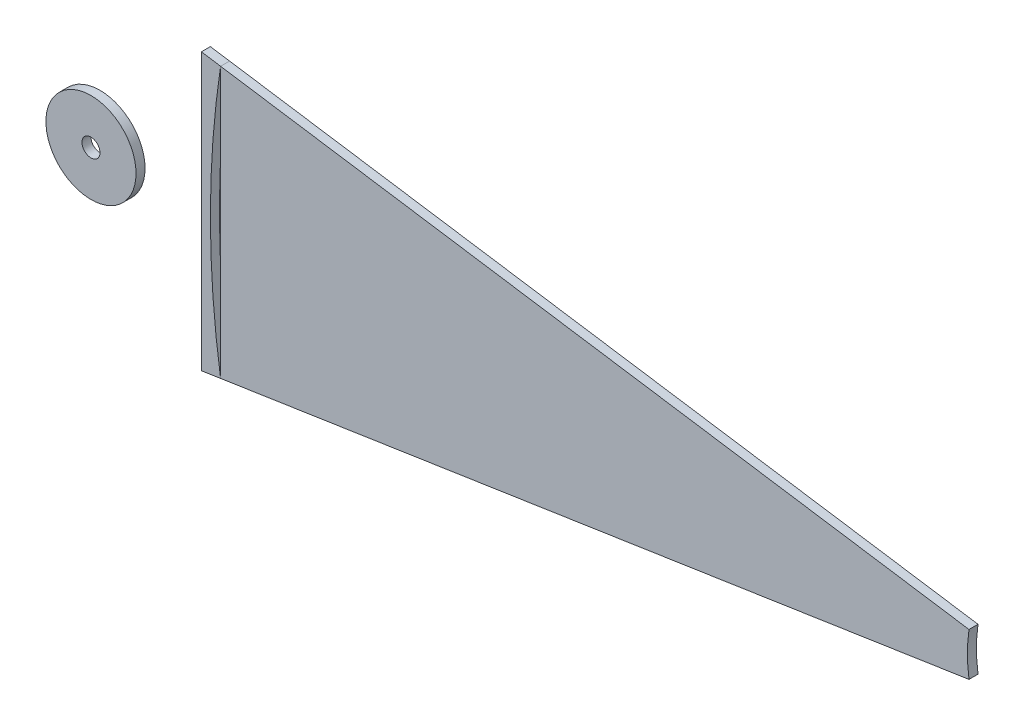
ISO-10303-21;
HEADER;
FILE_DESCRIPTION(('STEP AP214'),'2;1');
FILE_NAME('part.step','',(''),(''),'','','');
FILE_SCHEMA(('AUTOMOTIVE_DESIGN { 1 0 10303 214 1 1 1 1 }'));
ENDSEC;
DATA;
#1=APPLICATION_CONTEXT('core data for automotive mechanical design processes');
#2=APPLICATION_PROTOCOL_DEFINITION('international standard','automotive_design',2000,#1);
#3=PRODUCT_CONTEXT('',#1,'mechanical');
#4=PRODUCT('Part','Part','',(#3));
#5=PRODUCT_RELATED_PRODUCT_CATEGORY('part','',(#4));
#6=PRODUCT_DEFINITION_FORMATION('','',#4);
#7=PRODUCT_DEFINITION_CONTEXT('part definition',#1,'design');
#8=PRODUCT_DEFINITION('design','',#6,#7);
#9=PRODUCT_DEFINITION_SHAPE('','',#8);
#10=(LENGTH_UNIT() NAMED_UNIT(*) SI_UNIT(.MILLI.,.METRE.));
#11=(NAMED_UNIT(*) PLANE_ANGLE_UNIT() SI_UNIT($,.RADIAN.));
#12=(NAMED_UNIT(*) SI_UNIT($,.STERADIAN.) SOLID_ANGLE_UNIT());
#13=UNCERTAINTY_MEASURE_WITH_UNIT(LENGTH_MEASURE(1.E-05),#10,'distance_accuracy_value','');
#14=(GEOMETRIC_REPRESENTATION_CONTEXT(3) GLOBAL_UNCERTAINTY_ASSIGNED_CONTEXT((#13)) GLOBAL_UNIT_ASSIGNED_CONTEXT((#10,
#11,#12)) REPRESENTATION_CONTEXT('',''));
#15=CARTESIAN_POINT('',(0.,0.,0.));
#16=DIRECTION('',(0.,0.,1.));
#17=DIRECTION('',(1.,0.,0.));
#18=AXIS2_PLACEMENT_3D('',#15,#16,#17);
#19=CARTESIAN_POINT('',(-113.25,0.,-0.5));
#20=DIRECTION('',(0.,0.,1.));
#21=DIRECTION('',(1.,0.,0.));
#22=AXIS2_PLACEMENT_3D('',#19,#20,#21);
#23=CYLINDRICAL_SURFACE('',#22,5.);
#24=CARTESIAN_POINT('',(-113.25,0.,-0.5));
#25=DIRECTION('',(0.,0.,1.));
#26=DIRECTION('',(1.,0.,0.));
#27=AXIS2_PLACEMENT_3D('',#24,#25,#26);
#28=CIRCLE('',#27,5.);
#29=CARTESIAN_POINT('',(-108.25,0.,-0.5));
#30=VERTEX_POINT('',#29);
#31=EDGE_CURVE('E12',#30,#30,#28,.T.);
#32=ORIENTED_EDGE('',*,*,#31,.T.);
#33=EDGE_LOOP('',(#32));
#34=FACE_BOUND('',#33,.T.);
#35=CARTESIAN_POINT('',(-113.25,0.,0.5));
#36=DIRECTION('',(0.,0.,1.));
#37=DIRECTION('',(1.,0.,0.));
#38=AXIS2_PLACEMENT_3D('',#35,#36,#37);
#39=CIRCLE('',#38,5.);
#40=CARTESIAN_POINT('',(-108.25,0.,0.5));
#41=VERTEX_POINT('',#40);
#42=EDGE_CURVE('E100',#41,#41,#39,.T.);
#43=ORIENTED_EDGE('',*,*,#42,.F.);
#44=EDGE_LOOP('',(#43));
#45=FACE_BOUND('',#44,.T.);
#46=ADVANCED_FACE('F90',(#34,#45),#23,.T.);
#47=CARTESIAN_POINT('',(-113.25,0.,-0.5));
#48=DIRECTION('',(0.,0.,1.));
#49=DIRECTION('',(1.,0.,0.));
#50=AXIS2_PLACEMENT_3D('',#47,#48,#49);
#51=PLANE('',#50);
#52=CARTESIAN_POINT('',(-113.25,0.,-0.5));
#53=DIRECTION('',(0.,0.,1.));
#54=DIRECTION('',(1.,0.,0.));
#55=AXIS2_PLACEMENT_3D('',#52,#53,#54);
#56=CIRCLE('',#55,0.999999999999998);
#57=CARTESIAN_POINT('',(-112.25,0.,-0.5));
#58=VERTEX_POINT('',#57);
#59=EDGE_CURVE('E96',#58,#58,#56,.T.);
#60=ORIENTED_EDGE('',*,*,#59,.T.);
#61=EDGE_LOOP('',(#60));
#62=FACE_BOUND('',#61,.T.);
#63=ORIENTED_EDGE('',*,*,#31,.F.);
#64=EDGE_LOOP('',(#63));
#65=FACE_BOUND('',#64,.T.);
#66=ADVANCED_FACE('F119',(#62,#65),#51,.F.);
#67=CARTESIAN_POINT('',(-113.25,0.,-0.5));
#68=DIRECTION('',(0.,0.,1.));
#69=DIRECTION('',(1.,0.,0.));
#70=AXIS2_PLACEMENT_3D('',#67,#68,#69);
#71=CYLINDRICAL_SURFACE('',#70,0.999999999999998);
#72=ORIENTED_EDGE('',*,*,#59,.F.);
#73=EDGE_LOOP('',(#72));
#74=FACE_BOUND('',#73,.T.);
#75=CARTESIAN_POINT('',(-113.25,0.,0.5));
#76=DIRECTION('',(0.,0.,1.));
#77=DIRECTION('',(1.,0.,0.));
#78=AXIS2_PLACEMENT_3D('',#75,#76,#77);
#79=CIRCLE('',#78,0.999999999999998);
#80=CARTESIAN_POINT('',(-112.25,0.,0.5));
#81=VERTEX_POINT('',#80);
#82=EDGE_CURVE('E104',#81,#81,#79,.T.);
#83=ORIENTED_EDGE('',*,*,#82,.T.);
#84=EDGE_LOOP('',(#83));
#85=FACE_BOUND('',#84,.T.);
#86=ADVANCED_FACE('F110',(#74,#85),#71,.F.);
#87=CARTESIAN_POINT('',(-113.25,0.,0.5));
#88=DIRECTION('',(0.,0.,1.));
#89=DIRECTION('',(1.,0.,0.));
#90=AXIS2_PLACEMENT_3D('',#87,#88,#89);
#91=PLANE('',#90);
#92=ORIENTED_EDGE('',*,*,#42,.T.);
#93=EDGE_LOOP('',(#92));
#94=FACE_BOUND('',#93,.T.);
#95=ORIENTED_EDGE('',*,*,#82,.F.);
#96=EDGE_LOOP('',(#95));
#97=FACE_BOUND('',#96,.T.);
#98=ADVANCED_FACE('F112',(#94,#97),#91,.T.);
#99=CLOSED_SHELL('',(#46,#66,#86,#98));
#100=MANIFOLD_SOLID_BREP('B2',#99);
#101=CARTESIAN_POINT('',(-101.,0.,-0.5));
#102=DIRECTION('',(-1.,0.,0.));
#103=DIRECTION('',(0.,0.,1.));
#104=AXIS2_PLACEMENT_3D('',#101,#102,#103);
#105=PLANE('',#104);
#106=DIRECTION('',(0.,0.,1.));
#107=VECTOR('',#106,1.);
#108=CARTESIAN_POINT('',(-101.,-15.3233686439525,-0.5));
#109=LINE('',#108,#107);
#110=CARTESIAN_POINT('',(-101.,-15.3233686439525,-0.5));
#111=VERTEX_POINT('',#110);
#112=CARTESIAN_POINT('',(-101.,-15.3233686439525,0.5));
#113=VERTEX_POINT('',#112);
#114=EDGE_CURVE('E163',#111,#113,#109,.T.);
#115=ORIENTED_EDGE('',*,*,#114,.T.);
#116=DIRECTION('',(0.,-1.,0.));
#117=VECTOR('',#116,1.);
#118=CARTESIAN_POINT('',(-101.,0.,0.5));
#119=LINE('',#118,#117);
#120=CARTESIAN_POINT('',(-101.,15.3233686439523,0.5));
#121=VERTEX_POINT('',#120);
#122=EDGE_CURVE('E200',#121,#113,#119,.T.);
#123=ORIENTED_EDGE('',*,*,#122,.F.);
#124=DIRECTION('',(0.,0.,1.));
#125=VECTOR('',#124,1.);
#126=CARTESIAN_POINT('',(-101.,15.3233686439523,-0.5));
#127=LINE('',#126,#125);
#128=CARTESIAN_POINT('',(-101.,15.3233686439523,-0.5));
#129=VERTEX_POINT('',#128);
#130=EDGE_CURVE('E88',#129,#121,#127,.T.);
#131=ORIENTED_EDGE('',*,*,#130,.F.);
#132=DIRECTION('',(0.,-1.,0.));
#133=VECTOR('',#132,1.);
#134=CARTESIAN_POINT('',(-101.,0.,-0.5));
#135=LINE('',#134,#133);
#136=EDGE_CURVE('E201',#129,#111,#135,.T.);
#137=ORIENTED_EDGE('',*,*,#136,.T.);
#138=EDGE_LOOP('',(#115,#123,#131,#137));
#139=FACE_BOUND('',#138,.T.);
#140=ADVANCED_FACE('F160',(#139),#105,.T.);
#141=CARTESIAN_POINT('',(0.,0.,-0.5));
#142=DIRECTION('',(0.149999999999999,0.98868599666426,0.));
#143=DIRECTION('',(-0.98868599666426,0.149999999999999,0.));
#144=AXIS2_PLACEMENT_3D('',#141,#142,#143);
#145=PLANE('',#144);
#146=ORIENTED_EDGE('',*,*,#130,.T.);
#147=DIRECTION('',(-0.98868599666426,0.149999999999999,0.));
#148=VECTOR('',#147,1.);
#149=CARTESIAN_POINT('',(0.,0.,0.5));
#150=LINE('',#149,#148);
#151=CARTESIAN_POINT('',(-98.868599666426,15.,0.5));
#152=VERTEX_POINT('',#151);
#153=EDGE_CURVE('E218',#152,#121,#150,.T.);
#154=ORIENTED_EDGE('',*,*,#153,.F.);
#155=DIRECTION('',(0.,0.,1.));
#156=VECTOR('',#155,1.);
#157=CARTESIAN_POINT('',(-98.868599666426,15.,-0.5));
#158=LINE('',#157,#156);
#159=CARTESIAN_POINT('',(-98.868599666426,15.,-0.5));
#160=VERTEX_POINT('',#159);
#161=EDGE_CURVE('E168',#160,#152,#158,.T.);
#162=ORIENTED_EDGE('',*,*,#161,.F.);
#163=DIRECTION('',(-0.98868599666426,0.149999999999999,0.));
#164=VECTOR('',#163,1.);
#165=CARTESIAN_POINT('',(0.,0.,-0.5));
#166=LINE('',#165,#164);
#167=EDGE_CURVE('E206',#160,#129,#166,.T.);
#168=ORIENTED_EDGE('',*,*,#167,.T.);
#169=EDGE_LOOP('',(#146,#154,#162,#168));
#170=FACE_BOUND('',#169,.T.);
#171=ADVANCED_FACE('F232',(#170),#145,.T.);
#172=CARTESIAN_POINT('',(0.,0.,-0.5));
#173=DIRECTION('',(0.,0.,1.));
#174=DIRECTION('',(1.,0.,0.));
#175=AXIS2_PLACEMENT_3D('',#172,#173,#174);
#176=CYLINDRICAL_SURFACE('',#175,100.);
#177=ORIENTED_EDGE('',*,*,#161,.T.);
#178=CARTESIAN_POINT('',(0.,0.,0.5));
#179=DIRECTION('',(0.,0.,1.));
#180=DIRECTION('',(1.,0.,0.));
#181=AXIS2_PLACEMENT_3D('',#178,#179,#180);
#182=CIRCLE('',#181,100.);
#183=CARTESIAN_POINT('',(-98.868599666426,-15.,0.5));
#184=VERTEX_POINT('',#183);
#185=EDGE_CURVE('E214',#152,#184,#182,.T.);
#186=ORIENTED_EDGE('',*,*,#185,.T.);
#187=DIRECTION('',(0.,0.,1.));
#188=VECTOR('',#187,1.);
#189=CARTESIAN_POINT('',(-98.868599666426,-15.,-0.5));
#190=LINE('',#189,#188);
#191=CARTESIAN_POINT('',(-98.868599666426,-15.,-0.5));
#192=VERTEX_POINT('',#191);
#193=EDGE_CURVE('E205',#192,#184,#190,.T.);
#194=ORIENTED_EDGE('',*,*,#193,.F.);
#195=CARTESIAN_POINT('',(0.,0.,-0.5));
#196=DIRECTION('',(0.,0.,1.));
#197=DIRECTION('',(1.,0.,0.));
#198=AXIS2_PLACEMENT_3D('',#195,#196,#197);
#199=CIRCLE('',#198,100.);
#200=EDGE_CURVE('E226',#160,#192,#199,.T.);
#201=ORIENTED_EDGE('',*,*,#200,.F.);
#202=EDGE_LOOP('',(#177,#186,#194,#201));
#203=FACE_BOUND('',#202,.T.);
#204=ADVANCED_FACE('F230',(#203),#176,.F.);
#205=CARTESIAN_POINT('',(0.,0.,-0.5));
#206=DIRECTION('',(0.149999999999999,-0.98868599666426,0.));
#207=DIRECTION('',(0.98868599666426,0.149999999999999,0.));
#208=AXIS2_PLACEMENT_3D('',#205,#206,#207);
#209=PLANE('',#208);
#210=ORIENTED_EDGE('',*,*,#193,.T.);
#211=DIRECTION('',(0.98868599666426,0.149999999999999,0.));
#212=VECTOR('',#211,1.);
#213=CARTESIAN_POINT('',(0.,0.,0.5));
#214=LINE('',#213,#212);
#215=EDGE_CURVE('E208',#113,#184,#214,.T.);
#216=ORIENTED_EDGE('',*,*,#215,.F.);
#217=ORIENTED_EDGE('',*,*,#114,.F.);
#218=DIRECTION('',(0.98868599666426,0.149999999999999,0.));
#219=VECTOR('',#218,1.);
#220=CARTESIAN_POINT('',(0.,0.,-0.5));
#221=LINE('',#220,#219);
#222=EDGE_CURVE('E224',#111,#192,#221,.T.);
#223=ORIENTED_EDGE('',*,*,#222,.T.);
#224=EDGE_LOOP('',(#210,#216,#217,#223));
#225=FACE_BOUND('',#224,.T.);
#226=ADVANCED_FACE('F209',(#225),#209,.T.);
#227=CARTESIAN_POINT('',(0.,0.,-0.5));
#228=DIRECTION('',(0.,0.,1.));
#229=DIRECTION('',(1.,0.,0.));
#230=AXIS2_PLACEMENT_3D('',#227,#228,#229);
#231=PLANE('',#230);
#232=ORIENTED_EDGE('',*,*,#136,.F.);
#233=ORIENTED_EDGE('',*,*,#167,.F.);
#234=ORIENTED_EDGE('',*,*,#200,.T.);
#235=ORIENTED_EDGE('',*,*,#222,.F.);
#236=EDGE_LOOP('',(#232,#233,#234,#235));
#237=FACE_BOUND('',#236,.T.);
#238=ADVANCED_FACE('F234',(#237),#231,.F.);
#239=CARTESIAN_POINT('',(0.,0.,0.5));
#240=DIRECTION('',(0.,0.,1.));
#241=DIRECTION('',(1.,0.,0.));
#242=AXIS2_PLACEMENT_3D('',#239,#240,#241);
#243=PLANE('',#242);
#244=ORIENTED_EDGE('',*,*,#122,.T.);
#245=ORIENTED_EDGE('',*,*,#215,.T.);
#246=ORIENTED_EDGE('',*,*,#185,.F.);
#247=ORIENTED_EDGE('',*,*,#153,.T.);
#248=EDGE_LOOP('',(#244,#245,#246,#247));
#249=FACE_BOUND('',#248,.T.);
#250=ADVANCED_FACE('F217',(#249),#243,.T.);
#251=CLOSED_SHELL('',(#140,#171,#204,#226,#238,#250));
#252=MANIFOLD_SOLID_BREP('B7',#251);
#253=CARTESIAN_POINT('',(0.,0.,-0.5));
#254=DIRECTION('',(0.,0.,1.));
#255=DIRECTION('',(1.,0.,0.));
#256=AXIS2_PLACEMENT_3D('',#253,#254,#255);
#257=CYLINDRICAL_SURFACE('',#256,16.);
#258=DIRECTION('',(0.,0.,1.));
#259=VECTOR('',#258,1.);
#260=CARTESIAN_POINT('',(-15.8189759466282,2.4,-0.5));
#261=LINE('',#260,#259);
#262=CARTESIAN_POINT('',(-15.8189759466282,2.4,-0.5));
#263=VERTEX_POINT('',#262);
#264=CARTESIAN_POINT('',(-15.8189759466282,2.4,0.5));
#265=VERTEX_POINT('',#264);
#266=EDGE_CURVE('E298',#263,#265,#261,.T.);
#267=ORIENTED_EDGE('',*,*,#266,.T.);
#268=CARTESIAN_POINT('',(0.,0.,0.5));
#269=DIRECTION('',(0.,0.,1.));
#270=DIRECTION('',(1.,0.,0.));
#271=AXIS2_PLACEMENT_3D('',#268,#269,#270);
#272=CIRCLE('',#271,16.);
#273=CARTESIAN_POINT('',(-15.8189759466282,-2.4,0.5));
#274=VERTEX_POINT('',#273);
#275=EDGE_CURVE('E339',#265,#274,#272,.T.);
#276=ORIENTED_EDGE('',*,*,#275,.T.);
#277=DIRECTION('',(0.,0.,1.));
#278=VECTOR('',#277,1.);
#279=CARTESIAN_POINT('',(-15.8189759466282,-2.4,-0.5));
#280=LINE('',#279,#278);
#281=CARTESIAN_POINT('',(-15.8189759466282,-2.4,-0.5));
#282=VERTEX_POINT('',#281);
#283=EDGE_CURVE('E158',#282,#274,#280,.T.);
#284=ORIENTED_EDGE('',*,*,#283,.F.);
#285=CARTESIAN_POINT('',(0.,0.,-0.5));
#286=DIRECTION('',(0.,0.,1.));
#287=DIRECTION('',(1.,0.,0.));
#288=AXIS2_PLACEMENT_3D('',#285,#286,#287);
#289=CIRCLE('',#288,16.);
#290=EDGE_CURVE('E311',#263,#282,#289,.T.);
#291=ORIENTED_EDGE('',*,*,#290,.F.);
#292=EDGE_LOOP('',(#267,#276,#284,#291));
#293=FACE_BOUND('',#292,.T.);
#294=ADVANCED_FACE('F295',(#293),#257,.F.);
#295=CARTESIAN_POINT('',(0.,0.,-0.5));
#296=DIRECTION('',(0.15,-0.988685996664259,0.));
#297=DIRECTION('',(0.98868599666426,0.15,0.));
#298=AXIS2_PLACEMENT_3D('',#295,#296,#297);
#299=PLANE('',#298);
#300=ORIENTED_EDGE('',*,*,#283,.T.);
#301=DIRECTION('',(0.98868599666426,0.15,0.));
#302=VECTOR('',#301,1.);
#303=CARTESIAN_POINT('',(0.,0.,0.5));
#304=LINE('',#303,#302);
#305=CARTESIAN_POINT('',(-98.868599666426,-15.,0.5));
#306=VERTEX_POINT('',#305);
#307=EDGE_CURVE('E354',#306,#274,#304,.T.);
#308=ORIENTED_EDGE('',*,*,#307,.F.);
#309=DIRECTION('',(0.,0.,1.));
#310=VECTOR('',#309,1.);
#311=CARTESIAN_POINT('',(-98.868599666426,-15.,-0.5));
#312=LINE('',#311,#310);
#313=CARTESIAN_POINT('',(-98.868599666426,-15.,-0.5));
#314=VERTEX_POINT('',#313);
#315=EDGE_CURVE('E303',#314,#306,#312,.T.);
#316=ORIENTED_EDGE('',*,*,#315,.F.);
#317=DIRECTION('',(0.98868599666426,0.15,0.));
#318=VECTOR('',#317,1.);
#319=CARTESIAN_POINT('',(0.,0.,-0.5));
#320=LINE('',#319,#318);
#321=EDGE_CURVE('E343',#314,#282,#320,.T.);
#322=ORIENTED_EDGE('',*,*,#321,.T.);
#323=EDGE_LOOP('',(#300,#308,#316,#322));
#324=FACE_BOUND('',#323,.T.);
#325=ADVANCED_FACE('F368',(#324),#299,.T.);
#326=CARTESIAN_POINT('',(-98.868599666426,0.,-0.5));
#327=DIRECTION('',(-1.,0.,0.));
#328=DIRECTION('',(0.,0.,1.));
#329=AXIS2_PLACEMENT_3D('',#326,#327,#328);
#330=PLANE('',#329);
#331=ORIENTED_EDGE('',*,*,#315,.T.);
#332=DIRECTION('',(0.,-1.,0.));
#333=VECTOR('',#332,1.);
#334=CARTESIAN_POINT('',(-98.868599666426,0.,0.5));
#335=LINE('',#334,#333);
#336=CARTESIAN_POINT('',(-98.868599666426,15.,0.5));
#337=VERTEX_POINT('',#336);
#338=EDGE_CURVE('E350',#337,#306,#335,.T.);
#339=ORIENTED_EDGE('',*,*,#338,.F.);
#340=DIRECTION('',(0.,0.,1.));
#341=VECTOR('',#340,1.);
#342=CARTESIAN_POINT('',(-98.868599666426,15.,-0.5));
#343=LINE('',#342,#341);
#344=CARTESIAN_POINT('',(-98.868599666426,15.,-0.5));
#345=VERTEX_POINT('',#344);
#346=EDGE_CURVE('E342',#345,#337,#343,.T.);
#347=ORIENTED_EDGE('',*,*,#346,.F.);
#348=DIRECTION('',(0.,-1.,0.));
#349=VECTOR('',#348,1.);
#350=CARTESIAN_POINT('',(-98.868599666426,0.,-0.5));
#351=LINE('',#350,#349);
#352=EDGE_CURVE('E362',#345,#314,#351,.T.);
#353=ORIENTED_EDGE('',*,*,#352,.T.);
#354=EDGE_LOOP('',(#331,#339,#347,#353));
#355=FACE_BOUND('',#354,.T.);
#356=ADVANCED_FACE('F366',(#355),#330,.T.);
#357=CARTESIAN_POINT('',(0.,0.,-0.5));
#358=DIRECTION('',(0.15,0.988685996664259,0.));
#359=DIRECTION('',(-0.98868599666426,0.15,0.));
#360=AXIS2_PLACEMENT_3D('',#357,#358,#359);
#361=PLANE('',#360);
#362=ORIENTED_EDGE('',*,*,#346,.T.);
#363=DIRECTION('',(-0.98868599666426,0.15,0.));
#364=VECTOR('',#363,1.);
#365=CARTESIAN_POINT('',(0.,0.,0.5));
#366=LINE('',#365,#364);
#367=EDGE_CURVE('E345',#265,#337,#366,.T.);
#368=ORIENTED_EDGE('',*,*,#367,.F.);
#369=ORIENTED_EDGE('',*,*,#266,.F.);
#370=DIRECTION('',(-0.98868599666426,0.15,0.));
#371=VECTOR('',#370,1.);
#372=CARTESIAN_POINT('',(0.,0.,-0.5));
#373=LINE('',#372,#371);
#374=EDGE_CURVE('E360',#263,#345,#373,.T.);
#375=ORIENTED_EDGE('',*,*,#374,.T.);
#376=EDGE_LOOP('',(#362,#368,#369,#375));
#377=FACE_BOUND('',#376,.T.);
#378=ADVANCED_FACE('F346',(#377),#361,.T.);
#379=CARTESIAN_POINT('',(0.,0.,-0.5));
#380=DIRECTION('',(0.,0.,1.));
#381=DIRECTION('',(1.,0.,0.));
#382=AXIS2_PLACEMENT_3D('',#379,#380,#381);
#383=PLANE('',#382);
#384=ORIENTED_EDGE('',*,*,#290,.T.);
#385=ORIENTED_EDGE('',*,*,#321,.F.);
#386=ORIENTED_EDGE('',*,*,#352,.F.);
#387=ORIENTED_EDGE('',*,*,#374,.F.);
#388=EDGE_LOOP('',(#384,#385,#386,#387));
#389=FACE_BOUND('',#388,.T.);
#390=ADVANCED_FACE('F369',(#389),#383,.F.);
#391=CARTESIAN_POINT('',(0.,0.,0.5));
#392=DIRECTION('',(0.,0.,1.));
#393=DIRECTION('',(1.,0.,0.));
#394=AXIS2_PLACEMENT_3D('',#391,#392,#393);
#395=PLANE('',#394);
#396=ORIENTED_EDGE('',*,*,#275,.F.);
#397=ORIENTED_EDGE('',*,*,#367,.T.);
#398=ORIENTED_EDGE('',*,*,#338,.T.);
#399=ORIENTED_EDGE('',*,*,#307,.T.);
#400=EDGE_LOOP('',(#396,#397,#398,#399));
#401=FACE_BOUND('',#400,.T.);
#402=ADVANCED_FACE('F353',(#401),#395,.T.);
#403=CLOSED_SHELL('',(#294,#325,#356,#378,#390,#402));
#404=MANIFOLD_SOLID_BREP('B82',#403);
#405=ADVANCED_BREP_SHAPE_REPRESENTATION('',(#18,#100,#252,#404),#14);
#406=SHAPE_DEFINITION_REPRESENTATION(#9,#405);
ENDSEC;
END-ISO-10303-21;
